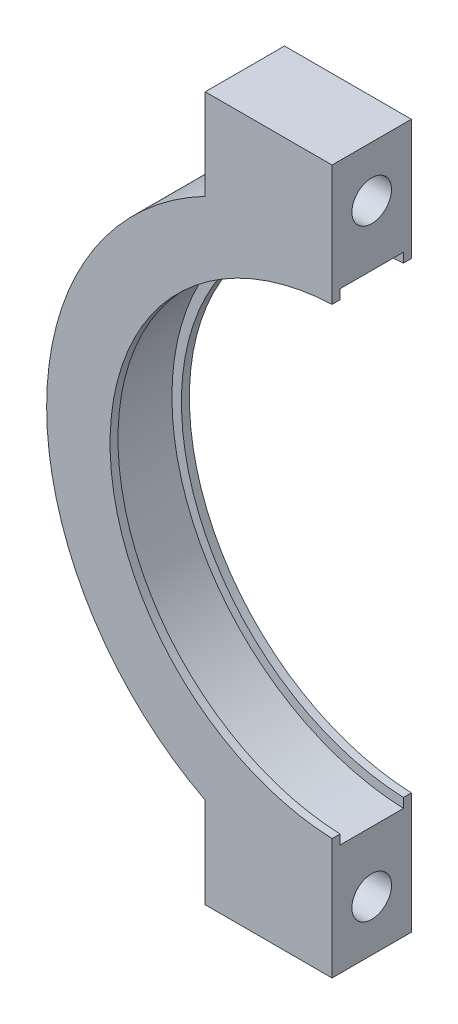
ISO-10303-21;
HEADER;
FILE_DESCRIPTION(('STEP AP214'),'2;1');
FILE_NAME('part.step','',(''),(''),'','','');
FILE_SCHEMA(('AUTOMOTIVE_DESIGN { 1 0 10303 214 1 1 1 1 }'));
ENDSEC;
DATA;
#1=APPLICATION_CONTEXT('core data for automotive mechanical design processes');
#2=APPLICATION_PROTOCOL_DEFINITION('international standard','automotive_design',2000,#1);
#3=PRODUCT_CONTEXT('',#1,'mechanical');
#4=PRODUCT('Part','Part','',(#3));
#5=PRODUCT_RELATED_PRODUCT_CATEGORY('part','',(#4));
#6=PRODUCT_DEFINITION_FORMATION('','',#4);
#7=PRODUCT_DEFINITION_CONTEXT('part definition',#1,'design');
#8=PRODUCT_DEFINITION('design','',#6,#7);
#9=PRODUCT_DEFINITION_SHAPE('','',#8);
#10=(LENGTH_UNIT() NAMED_UNIT(*) SI_UNIT(.MILLI.,.METRE.));
#11=(NAMED_UNIT(*) PLANE_ANGLE_UNIT() SI_UNIT($,.RADIAN.));
#12=(NAMED_UNIT(*) SI_UNIT($,.STERADIAN.) SOLID_ANGLE_UNIT());
#13=UNCERTAINTY_MEASURE_WITH_UNIT(LENGTH_MEASURE(1.E-05),#10,'distance_accuracy_value','');
#14=(GEOMETRIC_REPRESENTATION_CONTEXT(3) GLOBAL_UNCERTAINTY_ASSIGNED_CONTEXT((#13)) GLOBAL_UNIT_ASSIGNED_CONTEXT((#10,
#11,#12)) REPRESENTATION_CONTEXT('',''));
#15=CARTESIAN_POINT('',(0.,0.,0.));
#16=DIRECTION('',(0.,0.,1.));
#17=DIRECTION('',(1.,0.,0.));
#18=AXIS2_PLACEMENT_3D('',#15,#16,#17);
#19=CARTESIAN_POINT('',(0.,0.,25.));
#20=DIRECTION('',(0.,0.,-1.));
#21=DIRECTION('',(-1.,0.,0.));
#22=AXIS2_PLACEMENT_3D('',#19,#20,#21);
#23=CYLINDRICAL_SURFACE('',#22,73.);
#24=DIRECTION('',(0.,0.,-1.));
#25=VECTOR('',#24,1.);
#26=CARTESIAN_POINT('',(-2.99999999999891,72.9383301152419,25.));
#27=LINE('',#26,#25);
#28=CARTESIAN_POINT('',(-2.99999999999891,72.9383301152419,2.5));
#29=VERTEX_POINT('',#28);
#30=CARTESIAN_POINT('',(-2.99999999999891,72.9383301152419,0.));
#31=VERTEX_POINT('',#30);
#32=EDGE_CURVE('E201',#29,#31,#27,.T.);
#33=ORIENTED_EDGE('',*,*,#32,.F.);
#34=CARTESIAN_POINT('',(0.,0.,2.5));
#35=DIRECTION('',(0.,0.,1.));
#36=DIRECTION('',(1.,0.,0.));
#37=AXIS2_PLACEMENT_3D('',#34,#35,#36);
#38=CIRCLE('',#37,73.);
#39=CARTESIAN_POINT('',(-2.99999999999889,-72.9383301152419,2.5));
#40=VERTEX_POINT('',#39);
#41=EDGE_CURVE('E63',#29,#40,#38,.T.);
#42=ORIENTED_EDGE('',*,*,#41,.T.);
#43=DIRECTION('',(0.,0.,-1.));
#44=VECTOR('',#43,1.);
#45=CARTESIAN_POINT('',(-2.99999999999889,-72.9383301152419,25.));
#46=LINE('',#45,#44);
#47=CARTESIAN_POINT('',(-2.99999999999889,-72.9383301152419,0.));
#48=VERTEX_POINT('',#47);
#49=EDGE_CURVE('E55',#40,#48,#46,.T.);
#50=ORIENTED_EDGE('',*,*,#49,.T.);
#51=CARTESIAN_POINT('',(0.,0.,0.));
#52=DIRECTION('',(0.,0.,1.));
#53=DIRECTION('',(1.,0.,0.));
#54=AXIS2_PLACEMENT_3D('',#51,#52,#53);
#55=CIRCLE('',#54,73.);
#56=EDGE_CURVE('E164',#31,#48,#55,.T.);
#57=ORIENTED_EDGE('',*,*,#56,.F.);
#58=EDGE_LOOP('',(#33,#42,#50,#57));
#59=FACE_BOUND('',#58,.T.);
#60=ADVANCED_FACE('F45',(#59),#23,.F.);
#61=CARTESIAN_POINT('',(-2.9999999999989,0.,25.));
#62=DIRECTION('',(1.,0.,0.));
#63=DIRECTION('',(0.,1.,0.));
#64=AXIS2_PLACEMENT_3D('',#61,#62,#63);
#65=PLANE('',#64);
#66=DIRECTION('',(0.,-1.,0.));
#67=VECTOR('',#66,1.);
#68=CARTESIAN_POINT('',(-2.9999999999989,0.,22.5));
#69=LINE('',#68,#67);
#70=CARTESIAN_POINT('',(-2.99999999999889,-72.9383301152419,22.5));
#71=VERTEX_POINT('',#70);
#72=CARTESIAN_POINT('',(-2.99999999999889,-75.9407663906548,22.5));
#73=VERTEX_POINT('',#72);
#74=EDGE_CURVE('E290',#71,#73,#69,.T.);
#75=ORIENTED_EDGE('',*,*,#74,.F.);
#76=CARTESIAN_POINT('',(-2.99999999999889,-72.9383301152419,25.));
#77=VERTEX_POINT('',#76);
#78=EDGE_CURVE('E11',#77,#71,#46,.T.);
#79=ORIENTED_EDGE('',*,*,#78,.F.);
#80=DIRECTION('',(0.,-1.,0.));
#81=VECTOR('',#80,1.);
#82=CARTESIAN_POINT('',(-2.9999999999989,0.,25.));
#83=LINE('',#82,#81);
#84=CARTESIAN_POINT('',(-2.99999999999889,-111.,25.));
#85=VERTEX_POINT('',#84);
#86=EDGE_CURVE('E187',#77,#85,#83,.T.);
#87=ORIENTED_EDGE('',*,*,#86,.T.);
#88=DIRECTION('',(0.,0.,-1.));
#89=VECTOR('',#88,1.);
#90=CARTESIAN_POINT('',(-2.99999999999889,-111.,25.));
#91=LINE('',#90,#89);
#92=CARTESIAN_POINT('',(-2.99999999999889,-111.,0.));
#93=VERTEX_POINT('',#92);
#94=EDGE_CURVE('E72',#85,#93,#91,.T.);
#95=ORIENTED_EDGE('',*,*,#94,.T.);
#96=DIRECTION('',(0.,-1.,0.));
#97=VECTOR('',#96,1.);
#98=CARTESIAN_POINT('',(-2.9999999999989,0.,0.));
#99=LINE('',#98,#97);
#100=EDGE_CURVE('E161',#48,#93,#99,.T.);
#101=ORIENTED_EDGE('',*,*,#100,.F.);
#102=ORIENTED_EDGE('',*,*,#49,.F.);
#103=DIRECTION('',(0.,-1.,0.));
#104=VECTOR('',#103,1.);
#105=CARTESIAN_POINT('',(-2.9999999999989,0.,2.5));
#106=LINE('',#105,#104);
#107=CARTESIAN_POINT('',(-2.99999999999889,-75.9407663906548,2.5));
#108=VERTEX_POINT('',#107);
#109=EDGE_CURVE('E292',#40,#108,#106,.T.);
#110=ORIENTED_EDGE('',*,*,#109,.T.);
#111=DIRECTION('',(0.,0.,-1.));
#112=VECTOR('',#111,1.);
#113=CARTESIAN_POINT('',(-2.99999999999889,-75.9407663906548,22.5));
#114=LINE('',#113,#112);
#115=EDGE_CURVE('E282',#73,#108,#114,.T.);
#116=ORIENTED_EDGE('',*,*,#115,.F.);
#117=EDGE_LOOP('',(#75,#79,#87,#95,#101,#102,#110,#116));
#118=FACE_BOUND('',#117,.T.);
#119=CARTESIAN_POINT('',(-2.99999999999891,-95.,12.5));
#120=DIRECTION('',(1.,0.,0.));
#121=DIRECTION('',(0.,-1.,0.));
#122=AXIS2_PLACEMENT_3D('',#119,#120,#121);
#123=CIRCLE('',#122,6.25000000000001);
#124=CARTESIAN_POINT('',(-2.99999999999891,-101.25,12.5));
#125=VERTEX_POINT('',#124);
#126=EDGE_CURVE('E215',#125,#125,#123,.T.);
#127=ORIENTED_EDGE('',*,*,#126,.F.);
#128=EDGE_LOOP('',(#127));
#129=FACE_BOUND('',#128,.T.);
#130=ADVANCED_FACE('F47',(#118,#129),#65,.T.);
#131=CARTESIAN_POINT('',(0.,0.,22.5));
#132=DIRECTION('',(0.,0.,1.));
#133=DIRECTION('',(1.,0.,0.));
#134=AXIS2_PLACEMENT_3D('',#131,#132,#133);
#135=CIRCLE('',#134,73.);
#136=CARTESIAN_POINT('',(-2.99999999999891,72.9383301152419,22.5));
#137=VERTEX_POINT('',#136);
#138=EDGE_CURVE('E257',#137,#71,#135,.T.);
#139=ORIENTED_EDGE('',*,*,#138,.F.);
#140=CARTESIAN_POINT('',(-2.99999999999891,72.9383301152419,25.));
#141=VERTEX_POINT('',#140);
#142=EDGE_CURVE('E202',#141,#137,#27,.T.);
#143=ORIENTED_EDGE('',*,*,#142,.F.);
#144=CARTESIAN_POINT('',(0.,0.,25.));
#145=DIRECTION('',(0.,0.,1.));
#146=DIRECTION('',(1.,0.,0.));
#147=AXIS2_PLACEMENT_3D('',#144,#145,#146);
#148=CIRCLE('',#147,73.);
#149=EDGE_CURVE('E228',#141,#77,#148,.T.);
#150=ORIENTED_EDGE('',*,*,#149,.T.);
#151=ORIENTED_EDGE('',*,*,#78,.T.);
#152=EDGE_LOOP('',(#139,#143,#150,#151));
#153=FACE_BOUND('',#152,.T.);
#154=ADVANCED_FACE('F254',(#153),#23,.F.);
#155=CARTESIAN_POINT('',(-2.99999999999891,0.,25.));
#156=DIRECTION('',(1.,0.,0.));
#157=DIRECTION('',(0.,1.,0.));
#158=AXIS2_PLACEMENT_3D('',#155,#156,#157);
#159=PLANE('',#158);
#160=DIRECTION('',(0.,-1.,0.));
#161=VECTOR('',#160,1.);
#162=CARTESIAN_POINT('',(-2.99999999999891,0.,22.5));
#163=LINE('',#162,#161);
#164=CARTESIAN_POINT('',(-2.99999999999891,75.9407663906548,22.5));
#165=VERTEX_POINT('',#164);
#166=EDGE_CURVE('E265',#165,#137,#163,.T.);
#167=ORIENTED_EDGE('',*,*,#166,.F.);
#168=DIRECTION('',(0.,0.,-1.));
#169=VECTOR('',#168,1.);
#170=CARTESIAN_POINT('',(-2.99999999999891,75.9407663906548,22.5));
#171=LINE('',#170,#169);
#172=CARTESIAN_POINT('',(-2.99999999999891,75.9407663906548,2.5));
#173=VERTEX_POINT('',#172);
#174=EDGE_CURVE('E221',#165,#173,#171,.T.);
#175=ORIENTED_EDGE('',*,*,#174,.T.);
#176=DIRECTION('',(0.,-1.,0.));
#177=VECTOR('',#176,1.);
#178=CARTESIAN_POINT('',(-2.99999999999891,0.,2.5));
#179=LINE('',#178,#177);
#180=EDGE_CURVE('E293',#173,#29,#179,.T.);
#181=ORIENTED_EDGE('',*,*,#180,.T.);
#182=ORIENTED_EDGE('',*,*,#32,.T.);
#183=DIRECTION('',(0.,-1.,0.));
#184=VECTOR('',#183,1.);
#185=CARTESIAN_POINT('',(-2.99999999999891,0.,0.));
#186=LINE('',#185,#184);
#187=CARTESIAN_POINT('',(-2.99999999999891,111.,0.));
#188=VERTEX_POINT('',#187);
#189=EDGE_CURVE('E168',#188,#31,#186,.T.);
#190=ORIENTED_EDGE('',*,*,#189,.F.);
#191=DIRECTION('',(0.,0.,-1.));
#192=VECTOR('',#191,1.);
#193=CARTESIAN_POINT('',(-2.99999999999891,111.,25.));
#194=LINE('',#193,#192);
#195=CARTESIAN_POINT('',(-2.99999999999891,111.,25.));
#196=VERTEX_POINT('',#195);
#197=EDGE_CURVE('E198',#196,#188,#194,.T.);
#198=ORIENTED_EDGE('',*,*,#197,.F.);
#199=DIRECTION('',(0.,-1.,0.));
#200=VECTOR('',#199,1.);
#201=CARTESIAN_POINT('',(-2.99999999999891,0.,25.));
#202=LINE('',#201,#200);
#203=EDGE_CURVE('E232',#196,#141,#202,.T.);
#204=ORIENTED_EDGE('',*,*,#203,.T.);
#205=ORIENTED_EDGE('',*,*,#142,.T.);
#206=EDGE_LOOP('',(#167,#175,#181,#182,#190,#198,#204,#205));
#207=FACE_BOUND('',#206,.T.);
#208=CARTESIAN_POINT('',(-2.99999999999891,95.,12.5));
#209=DIRECTION('',(1.,0.,0.));
#210=DIRECTION('',(0.,1.,0.));
#211=AXIS2_PLACEMENT_3D('',#208,#209,#210);
#212=CIRCLE('',#211,6.25000000000001);
#213=CARTESIAN_POINT('',(-2.99999999999891,101.25,12.5));
#214=VERTEX_POINT('',#213);
#215=EDGE_CURVE('E208',#214,#214,#212,.T.);
#216=ORIENTED_EDGE('',*,*,#215,.F.);
#217=EDGE_LOOP('',(#216));
#218=FACE_BOUND('',#217,.T.);
#219=ADVANCED_FACE('F260',(#207,#218),#159,.T.);
#220=CARTESIAN_POINT('',(0.,111.,25.));
#221=DIRECTION('',(0.,-1.,0.));
#222=DIRECTION('',(1.,0.,0.));
#223=AXIS2_PLACEMENT_3D('',#220,#221,#222);
#224=PLANE('',#223);
#225=DIRECTION('',(-1.,0.,0.));
#226=VECTOR('',#225,1.);
#227=CARTESIAN_POINT('',(0.,111.,0.));
#228=LINE('',#227,#226);
#229=CARTESIAN_POINT('',(-42.9999999999989,111.,0.));
#230=VERTEX_POINT('',#229);
#231=EDGE_CURVE('E172',#188,#230,#228,.T.);
#232=ORIENTED_EDGE('',*,*,#231,.T.);
#233=DIRECTION('',(0.,0.,-1.));
#234=VECTOR('',#233,1.);
#235=CARTESIAN_POINT('',(-42.9999999999989,111.,25.));
#236=LINE('',#235,#234);
#237=CARTESIAN_POINT('',(-42.9999999999989,111.,25.));
#238=VERTEX_POINT('',#237);
#239=EDGE_CURVE('E194',#238,#230,#236,.T.);
#240=ORIENTED_EDGE('',*,*,#239,.F.);
#241=DIRECTION('',(-1.,0.,0.));
#242=VECTOR('',#241,1.);
#243=CARTESIAN_POINT('',(0.,111.,25.));
#244=LINE('',#243,#242);
#245=EDGE_CURVE('E236',#196,#238,#244,.T.);
#246=ORIENTED_EDGE('',*,*,#245,.F.);
#247=ORIENTED_EDGE('',*,*,#197,.T.);
#248=EDGE_LOOP('',(#232,#240,#246,#247));
#249=FACE_BOUND('',#248,.T.);
#250=ADVANCED_FACE('F244',(#249),#224,.F.);
#251=CARTESIAN_POINT('',(-42.9999999999989,0.,25.));
#252=DIRECTION('',(1.,0.,0.));
#253=DIRECTION('',(0.,1.,0.));
#254=AXIS2_PLACEMENT_3D('',#251,#252,#253);
#255=PLANE('',#254);
#256=CARTESIAN_POINT('',(-42.9999999999989,95.,12.5));
#257=DIRECTION('',(1.,0.,0.));
#258=DIRECTION('',(0.,1.,0.));
#259=AXIS2_PLACEMENT_3D('',#256,#257,#258);
#260=CIRCLE('',#259,6.25000000000001);
#261=CARTESIAN_POINT('',(-42.9999999999989,101.25,12.5));
#262=VERTEX_POINT('',#261);
#263=EDGE_CURVE('E49',#262,#262,#260,.T.);
#264=ORIENTED_EDGE('',*,*,#263,.T.);
#265=EDGE_LOOP('',(#264));
#266=FACE_BOUND('',#265,.T.);
#267=DIRECTION('',(0.,-1.,0.));
#268=VECTOR('',#267,1.);
#269=CARTESIAN_POINT('',(-42.9999999999989,0.,0.));
#270=LINE('',#269,#268);
#271=CARTESIAN_POINT('',(-42.9999999999989,82.4621125123538,0.));
#272=VERTEX_POINT('',#271);
#273=EDGE_CURVE('E175',#230,#272,#270,.T.);
#274=ORIENTED_EDGE('',*,*,#273,.T.);
#275=DIRECTION('',(0.,0.,-1.));
#276=VECTOR('',#275,1.);
#277=CARTESIAN_POINT('',(-42.9999999999989,82.4621125123538,25.));
#278=LINE('',#277,#276);
#279=CARTESIAN_POINT('',(-42.9999999999989,82.4621125123538,25.));
#280=VERTEX_POINT('',#279);
#281=EDGE_CURVE('E150',#280,#272,#278,.T.);
#282=ORIENTED_EDGE('',*,*,#281,.F.);
#283=DIRECTION('',(0.,-1.,0.));
#284=VECTOR('',#283,1.);
#285=CARTESIAN_POINT('',(-42.9999999999989,0.,25.));
#286=LINE('',#285,#284);
#287=EDGE_CURVE('E135',#238,#280,#286,.T.);
#288=ORIENTED_EDGE('',*,*,#287,.F.);
#289=ORIENTED_EDGE('',*,*,#239,.T.);
#290=EDGE_LOOP('',(#274,#282,#288,#289));
#291=FACE_BOUND('',#290,.T.);
#292=ADVANCED_FACE('F248',(#266,#291),#255,.F.);
#293=CARTESIAN_POINT('',(0.,0.,25.));
#294=DIRECTION('',(0.,0.,-1.));
#295=DIRECTION('',(-1.,0.,0.));
#296=AXIS2_PLACEMENT_3D('',#293,#294,#295);
#297=CYLINDRICAL_SURFACE('',#296,93.);
#298=CARTESIAN_POINT('',(0.,0.,0.));
#299=DIRECTION('',(0.,0.,1.));
#300=DIRECTION('',(1.,0.,0.));
#301=AXIS2_PLACEMENT_3D('',#298,#299,#300);
#302=CIRCLE('',#301,93.);
#303=CARTESIAN_POINT('',(-42.9999999999989,-82.4621125123538,0.));
#304=VERTEX_POINT('',#303);
#305=EDGE_CURVE('E145',#272,#304,#302,.T.);
#306=ORIENTED_EDGE('',*,*,#305,.T.);
#307=DIRECTION('',(0.,0.,-1.));
#308=VECTOR('',#307,1.);
#309=CARTESIAN_POINT('',(-42.9999999999989,-82.4621125123538,25.));
#310=LINE('',#309,#308);
#311=CARTESIAN_POINT('',(-42.9999999999989,-82.4621125123538,25.));
#312=VERTEX_POINT('',#311);
#313=EDGE_CURVE('E142',#312,#304,#310,.T.);
#314=ORIENTED_EDGE('',*,*,#313,.F.);
#315=CARTESIAN_POINT('',(0.,0.,25.));
#316=DIRECTION('',(0.,0.,1.));
#317=DIRECTION('',(1.,0.,0.));
#318=AXIS2_PLACEMENT_3D('',#315,#316,#317);
#319=CIRCLE('',#318,93.);
#320=EDGE_CURVE('E128',#280,#312,#319,.T.);
#321=ORIENTED_EDGE('',*,*,#320,.F.);
#322=ORIENTED_EDGE('',*,*,#281,.T.);
#323=EDGE_LOOP('',(#306,#314,#321,#322));
#324=FACE_BOUND('',#323,.T.);
#325=ADVANCED_FACE('F143',(#324),#297,.T.);
#326=CARTESIAN_POINT('',(-42.9999999999989,0.,25.));
#327=DIRECTION('',(-1.,0.,0.));
#328=DIRECTION('',(0.,0.,1.));
#329=AXIS2_PLACEMENT_3D('',#326,#327,#328);
#330=PLANE('',#329);
#331=CARTESIAN_POINT('',(-42.9999999999989,-95.,12.5));
#332=DIRECTION('',(-1.,0.,0.));
#333=DIRECTION('',(0.,0.,1.));
#334=AXIS2_PLACEMENT_3D('',#331,#332,#333);
#335=CIRCLE('',#334,6.25000000000001);
#336=CARTESIAN_POINT('',(-42.9999999999989,-95.,18.75));
#337=VERTEX_POINT('',#336);
#338=EDGE_CURVE('E205',#337,#337,#335,.T.);
#339=ORIENTED_EDGE('',*,*,#338,.F.);
#340=EDGE_LOOP('',(#339));
#341=FACE_BOUND('',#340,.T.);
#342=DIRECTION('',(0.,1.,0.));
#343=VECTOR('',#342,1.);
#344=CARTESIAN_POINT('',(-42.9999999999989,0.,0.));
#345=LINE('',#344,#343);
#346=CARTESIAN_POINT('',(-42.9999999999989,-111.,0.));
#347=VERTEX_POINT('',#346);
#348=EDGE_CURVE('E180',#347,#304,#345,.T.);
#349=ORIENTED_EDGE('',*,*,#348,.F.);
#350=DIRECTION('',(0.,0.,-1.));
#351=VECTOR('',#350,1.);
#352=CARTESIAN_POINT('',(-42.9999999999989,-111.,25.));
#353=LINE('',#352,#351);
#354=CARTESIAN_POINT('',(-42.9999999999989,-111.,25.));
#355=VERTEX_POINT('',#354);
#356=EDGE_CURVE('E151',#355,#347,#353,.T.);
#357=ORIENTED_EDGE('',*,*,#356,.F.);
#358=DIRECTION('',(0.,1.,0.));
#359=VECTOR('',#358,1.);
#360=CARTESIAN_POINT('',(-42.9999999999989,0.,25.));
#361=LINE('',#360,#359);
#362=EDGE_CURVE('E133',#355,#312,#361,.T.);
#363=ORIENTED_EDGE('',*,*,#362,.T.);
#364=ORIENTED_EDGE('',*,*,#313,.T.);
#365=EDGE_LOOP('',(#349,#357,#363,#364));
#366=FACE_BOUND('',#365,.T.);
#367=ADVANCED_FACE('F153',(#341,#366),#330,.T.);
#368=CARTESIAN_POINT('',(0.,-111.,25.));
#369=DIRECTION('',(0.,-1.,0.));
#370=DIRECTION('',(1.,0.,0.));
#371=AXIS2_PLACEMENT_3D('',#368,#369,#370);
#372=PLANE('',#371);
#373=DIRECTION('',(-1.,0.,0.));
#374=VECTOR('',#373,1.);
#375=CARTESIAN_POINT('',(0.,-111.,0.));
#376=LINE('',#375,#374);
#377=EDGE_CURVE('E183',#93,#347,#376,.T.);
#378=ORIENTED_EDGE('',*,*,#377,.F.);
#379=ORIENTED_EDGE('',*,*,#94,.F.);
#380=DIRECTION('',(-1.,0.,0.));
#381=VECTOR('',#380,1.);
#382=CARTESIAN_POINT('',(0.,-111.,25.));
#383=LINE('',#382,#381);
#384=EDGE_CURVE('E155',#85,#355,#383,.T.);
#385=ORIENTED_EDGE('',*,*,#384,.T.);
#386=ORIENTED_EDGE('',*,*,#356,.T.);
#387=EDGE_LOOP('',(#378,#379,#385,#386));
#388=FACE_BOUND('',#387,.T.);
#389=ADVANCED_FACE('F251',(#388),#372,.T.);
#390=CARTESIAN_POINT('',(0.,0.,25.));
#391=DIRECTION('',(0.,0.,1.));
#392=DIRECTION('',(1.,0.,0.));
#393=AXIS2_PLACEMENT_3D('',#390,#391,#392);
#394=PLANE('',#393);
#395=ORIENTED_EDGE('',*,*,#86,.F.);
#396=ORIENTED_EDGE('',*,*,#149,.F.);
#397=ORIENTED_EDGE('',*,*,#203,.F.);
#398=ORIENTED_EDGE('',*,*,#245,.T.);
#399=ORIENTED_EDGE('',*,*,#287,.T.);
#400=ORIENTED_EDGE('',*,*,#320,.T.);
#401=ORIENTED_EDGE('',*,*,#362,.F.);
#402=ORIENTED_EDGE('',*,*,#384,.F.);
#403=EDGE_LOOP('',(#395,#396,#397,#398,#399,#400,#401,#402));
#404=FACE_BOUND('',#403,.T.);
#405=ADVANCED_FACE('F130',(#404),#394,.T.);
#406=CARTESIAN_POINT('',(0.,0.,0.));
#407=DIRECTION('',(0.,0.,1.));
#408=DIRECTION('',(1.,0.,0.));
#409=AXIS2_PLACEMENT_3D('',#406,#407,#408);
#410=PLANE('',#409);
#411=ORIENTED_EDGE('',*,*,#100,.T.);
#412=ORIENTED_EDGE('',*,*,#377,.T.);
#413=ORIENTED_EDGE('',*,*,#348,.T.);
#414=ORIENTED_EDGE('',*,*,#305,.F.);
#415=ORIENTED_EDGE('',*,*,#273,.F.);
#416=ORIENTED_EDGE('',*,*,#231,.F.);
#417=ORIENTED_EDGE('',*,*,#189,.T.);
#418=ORIENTED_EDGE('',*,*,#56,.T.);
#419=EDGE_LOOP('',(#411,#412,#413,#414,#415,#416,#417,#418));
#420=FACE_BOUND('',#419,.T.);
#421=ADVANCED_FACE('F250',(#420),#410,.F.);
#422=CARTESIAN_POINT('',(-93.,-95.,12.5));
#423=DIRECTION('',(1.,0.,0.));
#424=DIRECTION('',(0.,1.,0.));
#425=AXIS2_PLACEMENT_3D('',#422,#423,#424);
#426=CYLINDRICAL_SURFACE('',#425,6.25000000000001);
#427=ORIENTED_EDGE('',*,*,#338,.T.);
#428=EDGE_LOOP('',(#427));
#429=FACE_BOUND('',#428,.T.);
#430=ORIENTED_EDGE('',*,*,#126,.T.);
#431=EDGE_LOOP('',(#430));
#432=FACE_BOUND('',#431,.T.);
#433=ADVANCED_FACE('F351',(#429,#432),#426,.F.);
#434=CARTESIAN_POINT('',(-93.,95.,12.5));
#435=DIRECTION('',(1.,0.,0.));
#436=DIRECTION('',(0.,1.,0.));
#437=AXIS2_PLACEMENT_3D('',#434,#435,#436);
#438=CYLINDRICAL_SURFACE('',#437,6.25000000000001);
#439=ORIENTED_EDGE('',*,*,#215,.T.);
#440=EDGE_LOOP('',(#439));
#441=FACE_BOUND('',#440,.T.);
#442=ORIENTED_EDGE('',*,*,#263,.F.);
#443=EDGE_LOOP('',(#442));
#444=FACE_BOUND('',#443,.T.);
#445=ADVANCED_FACE('F322',(#441,#444),#438,.F.);
#446=CARTESIAN_POINT('',(0.,0.,22.5));
#447=DIRECTION('',(0.,0.,-1.));
#448=DIRECTION('',(-1.,0.,0.));
#449=AXIS2_PLACEMENT_3D('',#446,#447,#448);
#450=CYLINDRICAL_SURFACE('',#449,76.);
#451=CARTESIAN_POINT('',(0.,0.,2.5));
#452=DIRECTION('',(0.,0.,1.));
#453=DIRECTION('',(1.,0.,0.));
#454=AXIS2_PLACEMENT_3D('',#451,#452,#453);
#455=CIRCLE('',#454,76.);
#456=EDGE_CURVE('E285',#173,#108,#455,.T.);
#457=ORIENTED_EDGE('',*,*,#456,.F.);
#458=ORIENTED_EDGE('',*,*,#174,.F.);
#459=CARTESIAN_POINT('',(0.,0.,22.5));
#460=DIRECTION('',(0.,0.,1.));
#461=DIRECTION('',(1.,0.,0.));
#462=AXIS2_PLACEMENT_3D('',#459,#460,#461);
#463=CIRCLE('',#462,76.);
#464=EDGE_CURVE('E286',#165,#73,#463,.T.);
#465=ORIENTED_EDGE('',*,*,#464,.T.);
#466=ORIENTED_EDGE('',*,*,#115,.T.);
#467=EDGE_LOOP('',(#457,#458,#465,#466));
#468=FACE_BOUND('',#467,.T.);
#469=ADVANCED_FACE('F284',(#468),#450,.F.);
#470=CARTESIAN_POINT('',(0.,0.,22.5));
#471=DIRECTION('',(0.,0.,1.));
#472=DIRECTION('',(1.,0.,0.));
#473=AXIS2_PLACEMENT_3D('',#470,#471,#472);
#474=PLANE('',#473);
#475=ORIENTED_EDGE('',*,*,#138,.T.);
#476=ORIENTED_EDGE('',*,*,#74,.T.);
#477=ORIENTED_EDGE('',*,*,#464,.F.);
#478=ORIENTED_EDGE('',*,*,#166,.T.);
#479=EDGE_LOOP('',(#475,#476,#477,#478));
#480=FACE_BOUND('',#479,.T.);
#481=ADVANCED_FACE('F314',(#480),#474,.F.);
#482=CARTESIAN_POINT('',(0.,0.,2.5));
#483=DIRECTION('',(0.,0.,1.));
#484=DIRECTION('',(1.,0.,0.));
#485=AXIS2_PLACEMENT_3D('',#482,#483,#484);
#486=PLANE('',#485);
#487=ORIENTED_EDGE('',*,*,#41,.F.);
#488=ORIENTED_EDGE('',*,*,#180,.F.);
#489=ORIENTED_EDGE('',*,*,#456,.T.);
#490=ORIENTED_EDGE('',*,*,#109,.F.);
#491=EDGE_LOOP('',(#487,#488,#489,#490));
#492=FACE_BOUND('',#491,.T.);
#493=ADVANCED_FACE('F291',(#492),#486,.T.);
#494=CLOSED_SHELL('',(#60,#130,#154,#219,#250,#292,#325,#367,#389,#405,#421,#433,#445,#469,#481,#493));
#495=MANIFOLD_SOLID_BREP('B2',#494);
#496=ADVANCED_BREP_SHAPE_REPRESENTATION('',(#18,#495),#14);
#497=SHAPE_DEFINITION_REPRESENTATION(#9,#496);
ENDSEC;
END-ISO-10303-21;
